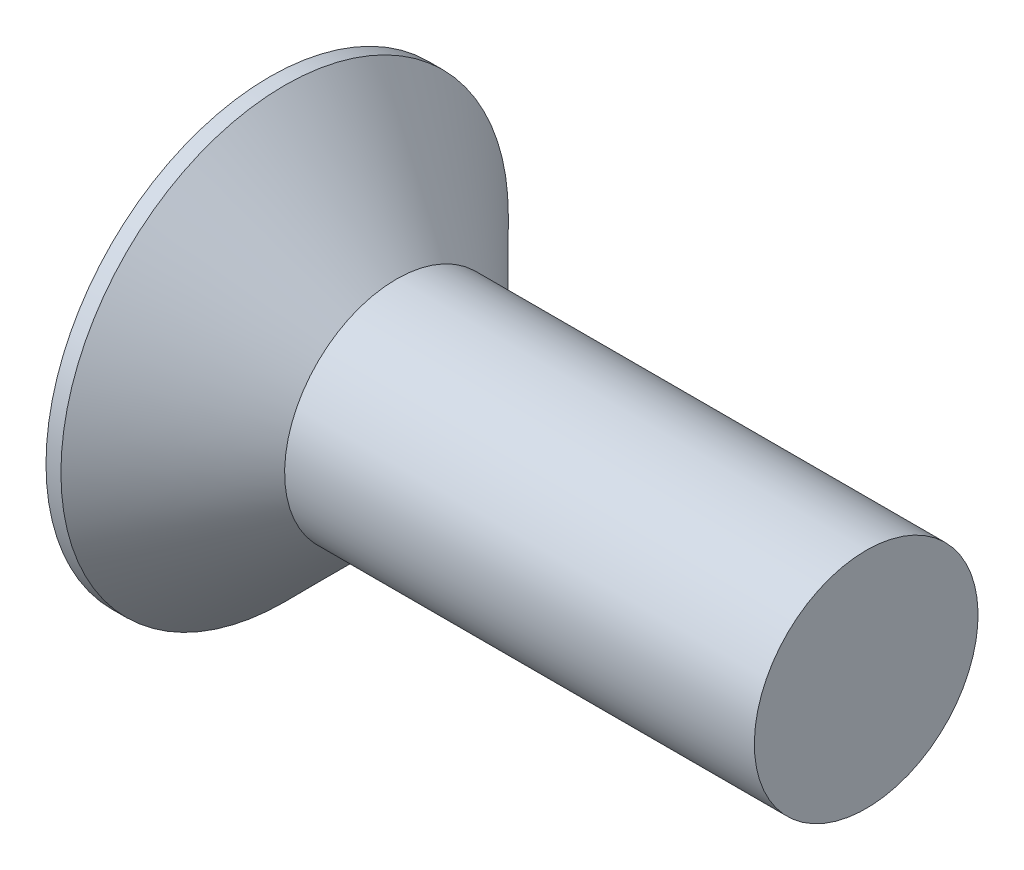
ISO-10303-21;
HEADER;
FILE_DESCRIPTION(('STEP AP214'),'2;1');
FILE_NAME('part.step','',(''),(''),'','','');
FILE_SCHEMA(('AUTOMOTIVE_DESIGN { 1 0 10303 214 1 1 1 1 }'));
ENDSEC;
DATA;
#1=APPLICATION_CONTEXT('core data for automotive mechanical design processes');
#2=APPLICATION_PROTOCOL_DEFINITION('international standard','automotive_design',2000,#1);
#3=PRODUCT_CONTEXT('',#1,'mechanical');
#4=PRODUCT('Part','Part','',(#3));
#5=PRODUCT_RELATED_PRODUCT_CATEGORY('part','',(#4));
#6=PRODUCT_DEFINITION_FORMATION('','',#4);
#7=PRODUCT_DEFINITION_CONTEXT('part definition',#1,'design');
#8=PRODUCT_DEFINITION('design','',#6,#7);
#9=PRODUCT_DEFINITION_SHAPE('','',#8);
#10=(LENGTH_UNIT() NAMED_UNIT(*) SI_UNIT(.MILLI.,.METRE.));
#11=(NAMED_UNIT(*) PLANE_ANGLE_UNIT() SI_UNIT($,.RADIAN.));
#12=(NAMED_UNIT(*) SI_UNIT($,.STERADIAN.) SOLID_ANGLE_UNIT());
#13=UNCERTAINTY_MEASURE_WITH_UNIT(LENGTH_MEASURE(1.E-05),#10,'distance_accuracy_value','');
#14=(GEOMETRIC_REPRESENTATION_CONTEXT(3) GLOBAL_UNCERTAINTY_ASSIGNED_CONTEXT((#13)) GLOBAL_UNIT_ASSIGNED_CONTEXT((#10,
#11,#12)) REPRESENTATION_CONTEXT('',''));
#15=CARTESIAN_POINT('',(0.,0.,0.));
#16=DIRECTION('',(0.,0.,1.));
#17=DIRECTION('',(1.,0.,0.));
#18=AXIS2_PLACEMENT_3D('',#15,#16,#17);
#19=CARTESIAN_POINT('',(0.,0.,0.));
#20=DIRECTION('',(1.,0.,0.));
#21=DIRECTION('',(0.,1.,0.));
#22=AXIS2_PLACEMENT_3D('',#19,#20,#21);
#23=PLANE('',#22);
#24=CARTESIAN_POINT('',(0.,0.,0.));
#25=DIRECTION('',(1.,0.,0.));
#26=DIRECTION('',(0.,1.,0.));
#27=AXIS2_PLACEMENT_3D('',#24,#25,#26);
#28=CIRCLE('',#27,3.);
#29=CARTESIAN_POINT('',(0.,3.,0.));
#30=VERTEX_POINT('',#29);
#31=EDGE_CURVE('E10',#30,#30,#28,.T.);
#32=ORIENTED_EDGE('',*,*,#31,.F.);
#33=EDGE_LOOP('',(#32));
#34=FACE_BOUND('',#33,.T.);
#35=ADVANCED_FACE('F33',(#34),#23,.F.);
#36=CARTESIAN_POINT('',(0.,0.,0.));
#37=DIRECTION('',(1.,0.,0.));
#38=DIRECTION('',(0.,1.,0.));
#39=AXIS2_PLACEMENT_3D('',#36,#37,#38);
#40=CYLINDRICAL_SURFACE('',#39,3.);
#41=CARTESIAN_POINT('',(0.199999999999984,0.,0.));
#42=DIRECTION('',(1.,0.,0.));
#43=DIRECTION('',(0.,1.,0.));
#44=AXIS2_PLACEMENT_3D('',#41,#42,#43);
#45=CIRCLE('',#44,3.);
#46=CARTESIAN_POINT('',(0.199999999999983,3.,0.));
#47=VERTEX_POINT('',#46);
#48=EDGE_CURVE('E39',#47,#47,#45,.T.);
#49=ORIENTED_EDGE('',*,*,#48,.F.);
#50=EDGE_LOOP('',(#49));
#51=FACE_BOUND('',#50,.T.);
#52=ORIENTED_EDGE('',*,*,#31,.T.);
#53=EDGE_LOOP('',(#52));
#54=FACE_BOUND('',#53,.T.);
#55=ADVANCED_FACE('F63',(#51,#54),#40,.T.);
#56=CARTESIAN_POINT('',(0.199999999999984,0.,0.));
#57=DIRECTION('',(-1.,0.,0.));
#58=DIRECTION('',(0.,-1.,0.));
#59=AXIS2_PLACEMENT_3D('',#56,#57,#58);
#60=CONICAL_SURFACE('',#59,3.,0.785398163397443);
#61=CARTESIAN_POINT('',(1.7,0.,0.));
#62=DIRECTION('',(1.,0.,0.));
#63=DIRECTION('',(0.,1.,0.));
#64=AXIS2_PLACEMENT_3D('',#61,#62,#63);
#65=CIRCLE('',#64,1.5);
#66=CARTESIAN_POINT('',(1.7,1.5,0.));
#67=VERTEX_POINT('',#66);
#68=EDGE_CURVE('E43',#67,#67,#65,.T.);
#69=ORIENTED_EDGE('',*,*,#68,.F.);
#70=EDGE_LOOP('',(#69));
#71=FACE_BOUND('',#70,.T.);
#72=ORIENTED_EDGE('',*,*,#48,.T.);
#73=EDGE_LOOP('',(#72));
#74=FACE_BOUND('',#73,.T.);
#75=ADVANCED_FACE('F58',(#71,#74),#60,.T.);
#76=CARTESIAN_POINT('',(0.,0.,0.));
#77=DIRECTION('',(1.,0.,0.));
#78=DIRECTION('',(0.,1.,0.));
#79=AXIS2_PLACEMENT_3D('',#76,#77,#78);
#80=CYLINDRICAL_SURFACE('',#79,1.5);
#81=CARTESIAN_POINT('',(8.,0.,0.));
#82=DIRECTION('',(1.,0.,0.));
#83=DIRECTION('',(0.,1.,0.));
#84=AXIS2_PLACEMENT_3D('',#81,#82,#83);
#85=CIRCLE('',#84,1.5);
#86=CARTESIAN_POINT('',(8.,1.5,0.));
#87=VERTEX_POINT('',#86);
#88=EDGE_CURVE('E47',#87,#87,#85,.T.);
#89=ORIENTED_EDGE('',*,*,#88,.F.);
#90=EDGE_LOOP('',(#89));
#91=FACE_BOUND('',#90,.T.);
#92=ORIENTED_EDGE('',*,*,#68,.T.);
#93=EDGE_LOOP('',(#92));
#94=FACE_BOUND('',#93,.T.);
#95=ADVANCED_FACE('F55',(#91,#94),#80,.T.);
#96=CARTESIAN_POINT('',(8.,-1.5,0.));
#97=DIRECTION('',(-1.,0.,0.));
#98=DIRECTION('',(0.,-1.,0.));
#99=AXIS2_PLACEMENT_3D('',#96,#97,#98);
#100=PLANE('',#99);
#101=ORIENTED_EDGE('',*,*,#88,.T.);
#102=EDGE_LOOP('',(#101));
#103=FACE_BOUND('',#102,.T.);
#104=ADVANCED_FACE('F53',(#103),#100,.F.);
#105=CLOSED_SHELL('',(#35,#55,#75,#95,#104));
#106=MANIFOLD_SOLID_BREP('B2',#105);
#107=ADVANCED_BREP_SHAPE_REPRESENTATION('',(#18,#106),#14);
#108=SHAPE_DEFINITION_REPRESENTATION(#9,#107);
ENDSEC;
END-ISO-10303-21;
